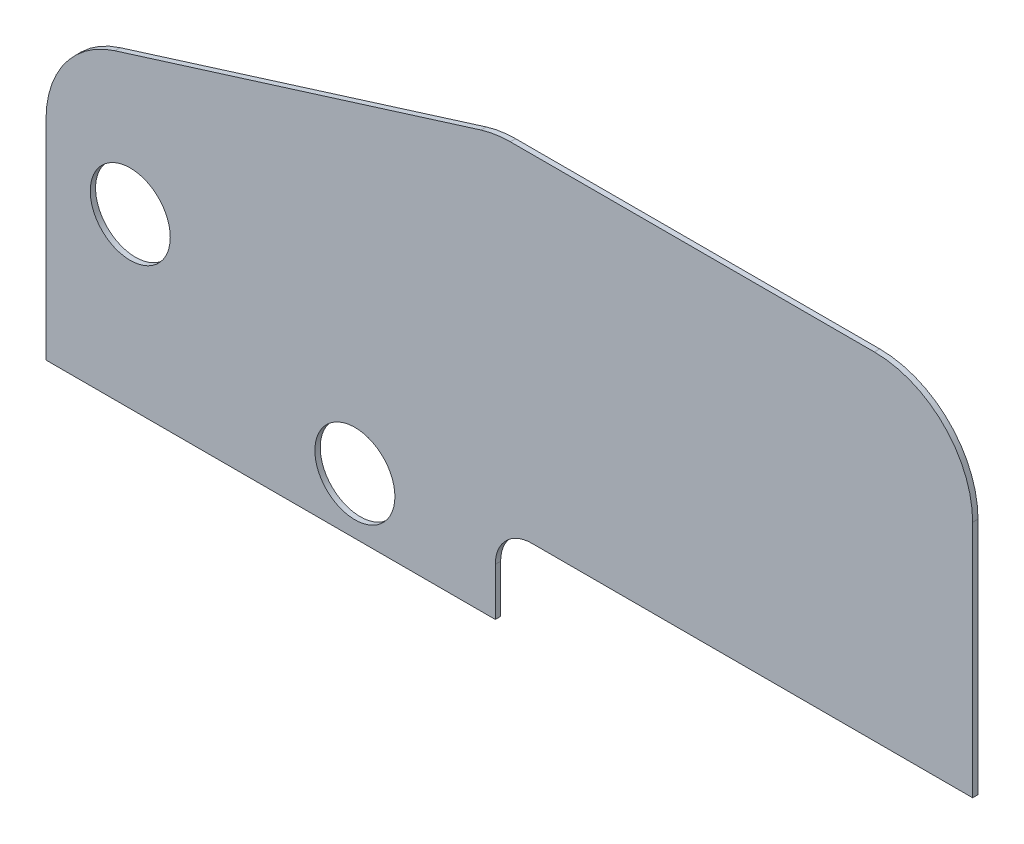
ISO-10303-21;
HEADER;
FILE_DESCRIPTION(('STEP AP214'),'2;1');
FILE_NAME('part.step','',(''),(''),'','','');
FILE_SCHEMA(('AUTOMOTIVE_DESIGN { 1 0 10303 214 1 1 1 1 }'));
ENDSEC;
DATA;
#1=APPLICATION_CONTEXT('core data for automotive mechanical design processes');
#2=APPLICATION_PROTOCOL_DEFINITION('international standard','automotive_design',2000,#1);
#3=PRODUCT_CONTEXT('',#1,'mechanical');
#4=PRODUCT('Part','Part','',(#3));
#5=PRODUCT_RELATED_PRODUCT_CATEGORY('part','',(#4));
#6=PRODUCT_DEFINITION_FORMATION('','',#4);
#7=PRODUCT_DEFINITION_CONTEXT('part definition',#1,'design');
#8=PRODUCT_DEFINITION('design','',#6,#7);
#9=PRODUCT_DEFINITION_SHAPE('','',#8);
#10=(LENGTH_UNIT() NAMED_UNIT(*) SI_UNIT(.MILLI.,.METRE.));
#11=(NAMED_UNIT(*) PLANE_ANGLE_UNIT() SI_UNIT($,.RADIAN.));
#12=(NAMED_UNIT(*) SI_UNIT($,.STERADIAN.) SOLID_ANGLE_UNIT());
#13=UNCERTAINTY_MEASURE_WITH_UNIT(LENGTH_MEASURE(1.E-05),#10,'distance_accuracy_value','');
#14=(GEOMETRIC_REPRESENTATION_CONTEXT(3) GLOBAL_UNCERTAINTY_ASSIGNED_CONTEXT((#13)) GLOBAL_UNIT_ASSIGNED_CONTEXT((#10,
#11,#12)) REPRESENTATION_CONTEXT('',''));
#15=CARTESIAN_POINT('',(0.,0.,0.));
#16=DIRECTION('',(0.,0.,1.));
#17=DIRECTION('',(1.,0.,0.));
#18=AXIS2_PLACEMENT_3D('',#15,#16,#17);
#19=CARTESIAN_POINT('',(0.,0.,1.9));
#20=DIRECTION('',(-1.,0.,0.));
#21=DIRECTION('',(0.,-1.,0.));
#22=AXIS2_PLACEMENT_3D('',#19,#20,#21);
#23=PLANE('',#22);
#24=DIRECTION('',(0.,1.,0.));
#25=VECTOR('',#24,1.);
#26=CARTESIAN_POINT('',(0.,0.,0.));
#27=LINE('',#26,#25);
#28=CARTESIAN_POINT('',(0.,-30.,0.));
#29=VERTEX_POINT('',#28);
#30=CARTESIAN_POINT('',(0.,-13.,0.));
#31=VERTEX_POINT('',#30);
#32=EDGE_CURVE('E176',#29,#31,#27,.T.);
#33=ORIENTED_EDGE('',*,*,#32,.T.);
#34=DIRECTION('',(0.,0.,-1.));
#35=VECTOR('',#34,1.);
#36=CARTESIAN_POINT('',(0.,-13.,1.9));
#37=LINE('',#36,#35);
#38=CARTESIAN_POINT('',(0.,-13.,1.9));
#39=VERTEX_POINT('',#38);
#40=EDGE_CURVE('E207',#31,#39,#37,.F.);
#41=ORIENTED_EDGE('',*,*,#40,.T.);
#42=DIRECTION('',(0.,1.,0.));
#43=VECTOR('',#42,1.);
#44=CARTESIAN_POINT('',(0.,0.,1.9));
#45=LINE('',#44,#43);
#46=CARTESIAN_POINT('',(0.,-30.,1.9));
#47=VERTEX_POINT('',#46);
#48=EDGE_CURVE('E141',#47,#39,#45,.T.);
#49=ORIENTED_EDGE('',*,*,#48,.F.);
#50=DIRECTION('',(0.,0.,-1.));
#51=VECTOR('',#50,1.);
#52=CARTESIAN_POINT('',(0.,-30.,1.9));
#53=LINE('',#52,#51);
#54=EDGE_CURVE('E175',#47,#29,#53,.T.);
#55=ORIENTED_EDGE('',*,*,#54,.T.);
#56=EDGE_LOOP('',(#33,#41,#49,#55));
#57=FACE_BOUND('',#56,.T.);
#58=ADVANCED_FACE('F43',(#57),#23,.F.);
#59=CARTESIAN_POINT('',(170.,0.,1.9));
#60=DIRECTION('',(0.,1.,0.));
#61=DIRECTION('',(-1.,0.,0.));
#62=AXIS2_PLACEMENT_3D('',#59,#60,#61);
#63=PLANE('',#62);
#64=DIRECTION('',(1.,0.,0.));
#65=VECTOR('',#64,1.);
#66=CARTESIAN_POINT('',(170.,0.,1.9));
#67=LINE('',#66,#65);
#68=CARTESIAN_POINT('',(13.,0.,1.9));
#69=VERTEX_POINT('',#68);
#70=CARTESIAN_POINT('',(170.,0.,1.9));
#71=VERTEX_POINT('',#70);
#72=EDGE_CURVE('E128',#69,#71,#67,.T.);
#73=ORIENTED_EDGE('',*,*,#72,.F.);
#74=DIRECTION('',(0.,0.,-1.));
#75=VECTOR('',#74,1.);
#76=CARTESIAN_POINT('',(13.,0.,0.));
#77=LINE('',#76,#75);
#78=CARTESIAN_POINT('',(13.,0.,0.));
#79=VERTEX_POINT('',#78);
#80=EDGE_CURVE('E152',#69,#79,#77,.T.);
#81=ORIENTED_EDGE('',*,*,#80,.T.);
#82=DIRECTION('',(1.,0.,0.));
#83=VECTOR('',#82,1.);
#84=CARTESIAN_POINT('',(170.,0.,0.));
#85=LINE('',#84,#83);
#86=CARTESIAN_POINT('',(170.,0.,0.));
#87=VERTEX_POINT('',#86);
#88=EDGE_CURVE('E147',#79,#87,#85,.T.);
#89=ORIENTED_EDGE('',*,*,#88,.T.);
#90=DIRECTION('',(0.,0.,-1.));
#91=VECTOR('',#90,1.);
#92=CARTESIAN_POINT('',(170.,0.,1.9));
#93=LINE('',#92,#91);
#94=EDGE_CURVE('E144',#71,#87,#93,.T.);
#95=ORIENTED_EDGE('',*,*,#94,.F.);
#96=EDGE_LOOP('',(#73,#81,#89,#95));
#97=FACE_BOUND('',#96,.T.);
#98=ADVANCED_FACE('F145',(#97),#63,.F.);
#99=CARTESIAN_POINT('',(170.,120.,1.9));
#100=DIRECTION('',(-1.,0.,0.));
#101=DIRECTION('',(0.,-1.,0.));
#102=AXIS2_PLACEMENT_3D('',#99,#100,#101);
#103=PLANE('',#102);
#104=DIRECTION('',(0.,1.,0.));
#105=VECTOR('',#104,1.);
#106=CARTESIAN_POINT('',(170.,120.,0.));
#107=LINE('',#106,#105);
#108=CARTESIAN_POINT('',(170.,85.,0.));
#109=VERTEX_POINT('',#108);
#110=EDGE_CURVE('E183',#87,#109,#107,.T.);
#111=ORIENTED_EDGE('',*,*,#110,.T.);
#112=DIRECTION('',(0.,0.,-1.));
#113=VECTOR('',#112,1.);
#114=CARTESIAN_POINT('',(170.,85.,1.9));
#115=LINE('',#114,#113);
#116=CARTESIAN_POINT('',(170.,85.,1.9));
#117=VERTEX_POINT('',#116);
#118=EDGE_CURVE('E157',#109,#117,#115,.F.);
#119=ORIENTED_EDGE('',*,*,#118,.T.);
#120=DIRECTION('',(0.,1.,0.));
#121=VECTOR('',#120,1.);
#122=CARTESIAN_POINT('',(170.,120.,1.9));
#123=LINE('',#122,#121);
#124=EDGE_CURVE('E132',#71,#117,#123,.T.);
#125=ORIENTED_EDGE('',*,*,#124,.F.);
#126=ORIENTED_EDGE('',*,*,#94,.T.);
#127=EDGE_LOOP('',(#111,#119,#125,#126));
#128=FACE_BOUND('',#127,.T.);
#129=ADVANCED_FACE('F155',(#128),#103,.F.);
#130=CARTESIAN_POINT('',(0.,120.,1.9));
#131=DIRECTION('',(0.,-1.,0.));
#132=DIRECTION('',(0.,0.,-1.));
#133=AXIS2_PLACEMENT_3D('',#130,#131,#132);
#134=PLANE('',#133);
#135=DIRECTION('',(-1.,0.,0.));
#136=VECTOR('',#135,1.);
#137=CARTESIAN_POINT('',(0.,120.,1.9));
#138=LINE('',#137,#136);
#139=CARTESIAN_POINT('',(135.,120.,1.9));
#140=VERTEX_POINT('',#139);
#141=CARTESIAN_POINT('',(5.34138229968142,120.,1.9));
#142=VERTEX_POINT('',#141);
#143=EDGE_CURVE('E159',#140,#142,#138,.T.);
#144=ORIENTED_EDGE('',*,*,#143,.F.);
#145=DIRECTION('',(0.,0.,-1.));
#146=VECTOR('',#145,1.);
#147=CARTESIAN_POINT('',(135.,120.,1.9));
#148=LINE('',#147,#146);
#149=CARTESIAN_POINT('',(135.,120.,0.));
#150=VERTEX_POINT('',#149);
#151=EDGE_CURVE('E218',#140,#150,#148,.T.);
#152=ORIENTED_EDGE('',*,*,#151,.T.);
#153=DIRECTION('',(-1.,0.,0.));
#154=VECTOR('',#153,1.);
#155=CARTESIAN_POINT('',(0.,120.,0.));
#156=LINE('',#155,#154);
#157=CARTESIAN_POINT('',(5.34138229968142,120.,0.));
#158=VERTEX_POINT('',#157);
#159=EDGE_CURVE('E186',#150,#158,#156,.T.);
#160=ORIENTED_EDGE('',*,*,#159,.T.);
#161=DIRECTION('',(0.,0.,-1.));
#162=VECTOR('',#161,1.);
#163=CARTESIAN_POINT('',(5.34138229968142,120.,1.9));
#164=LINE('',#163,#162);
#165=EDGE_CURVE('E215',#158,#142,#164,.F.);
#166=ORIENTED_EDGE('',*,*,#165,.T.);
#167=EDGE_LOOP('',(#144,#152,#160,#166));
#168=FACE_BOUND('',#167,.T.);
#169=ADVANCED_FACE('F331',(#168),#134,.F.);
#170=CARTESIAN_POINT('',(-160.,70.,1.9));
#171=DIRECTION('',(0.298274993135947,-0.95447997803503,0.));
#172=DIRECTION('',(0.95447997803503,0.298274993135947,0.));
#173=AXIS2_PLACEMENT_3D('',#170,#171,#172);
#174=PLANE('',#173);
#175=DIRECTION('',(-0.95447997803503,-0.298274993135947,0.));
#176=VECTOR('',#175,1.);
#177=CARTESIAN_POINT('',(-160.,70.,1.9));
#178=LINE('',#177,#176);
#179=CARTESIAN_POINT('',(-5.09824246007673,118.406799231226,1.9));
#180=VERTEX_POINT('',#179);
#181=CARTESIAN_POINT('',(-135.439624759758,77.6751172625756,1.9));
#182=VERTEX_POINT('',#181);
#183=EDGE_CURVE('E163',#180,#182,#178,.T.);
#184=ORIENTED_EDGE('',*,*,#183,.F.);
#185=DIRECTION('',(0.,0.,-1.));
#186=VECTOR('',#185,1.);
#187=CARTESIAN_POINT('',(-5.0982424600767,118.406799231226,1.9));
#188=LINE('',#187,#186);
#189=CARTESIAN_POINT('',(-5.09824246007673,118.406799231226,0.));
#190=VERTEX_POINT('',#189);
#191=EDGE_CURVE('E52',#180,#190,#188,.T.);
#192=ORIENTED_EDGE('',*,*,#191,.T.);
#193=DIRECTION('',(-0.95447997803503,-0.298274993135947,0.));
#194=VECTOR('',#193,1.);
#195=CARTESIAN_POINT('',(-160.,70.,0.));
#196=LINE('',#195,#194);
#197=CARTESIAN_POINT('',(-135.439624759758,77.6751172625756,0.));
#198=VERTEX_POINT('',#197);
#199=EDGE_CURVE('E190',#190,#198,#196,.T.);
#200=ORIENTED_EDGE('',*,*,#199,.T.);
#201=DIRECTION('',(0.,0.,-1.));
#202=VECTOR('',#201,1.);
#203=CARTESIAN_POINT('',(-135.439624759758,77.6751172625756,1.9));
#204=LINE('',#203,#202);
#205=EDGE_CURVE('E67',#198,#182,#204,.F.);
#206=ORIENTED_EDGE('',*,*,#205,.T.);
#207=EDGE_LOOP('',(#184,#192,#200,#206));
#208=FACE_BOUND('',#207,.T.);
#209=ADVANCED_FACE('F246',(#208),#174,.F.);
#210=CARTESIAN_POINT('',(-160.,-30.,1.9));
#211=DIRECTION('',(1.,0.,0.));
#212=DIRECTION('',(0.,0.,-1.));
#213=AXIS2_PLACEMENT_3D('',#210,#211,#212);
#214=PLANE('',#213);
#215=DIRECTION('',(0.,-1.,0.));
#216=VECTOR('',#215,1.);
#217=CARTESIAN_POINT('',(-160.,-30.,1.9));
#218=LINE('',#217,#216);
#219=CARTESIAN_POINT('',(-160.,44.2683180313495,1.9));
#220=VERTEX_POINT('',#219);
#221=CARTESIAN_POINT('',(-160.,-30.,1.9));
#222=VERTEX_POINT('',#221);
#223=EDGE_CURVE('E169',#220,#222,#218,.T.);
#224=ORIENTED_EDGE('',*,*,#223,.F.);
#225=DIRECTION('',(0.,0.,-1.));
#226=VECTOR('',#225,1.);
#227=CARTESIAN_POINT('',(-160.,44.2683180313495,1.9));
#228=LINE('',#227,#226);
#229=CARTESIAN_POINT('',(-160.,44.2683180313495,0.));
#230=VERTEX_POINT('',#229);
#231=EDGE_CURVE('E11',#220,#230,#228,.T.);
#232=ORIENTED_EDGE('',*,*,#231,.T.);
#233=DIRECTION('',(0.,-1.,0.));
#234=VECTOR('',#233,1.);
#235=CARTESIAN_POINT('',(-160.,-30.,0.));
#236=LINE('',#235,#234);
#237=CARTESIAN_POINT('',(-160.,-30.,0.));
#238=VERTEX_POINT('',#237);
#239=EDGE_CURVE('E193',#230,#238,#236,.T.);
#240=ORIENTED_EDGE('',*,*,#239,.T.);
#241=DIRECTION('',(0.,0.,-1.));
#242=VECTOR('',#241,1.);
#243=CARTESIAN_POINT('',(-160.,-30.,1.9));
#244=LINE('',#243,#242);
#245=EDGE_CURVE('E153',#222,#238,#244,.T.);
#246=ORIENTED_EDGE('',*,*,#245,.F.);
#247=EDGE_LOOP('',(#224,#232,#240,#246));
#248=FACE_BOUND('',#247,.T.);
#249=ADVANCED_FACE('F257',(#248),#214,.F.);
#250=CARTESIAN_POINT('',(0.,-30.,1.9));
#251=DIRECTION('',(0.,1.,0.));
#252=DIRECTION('',(-1.,0.,0.));
#253=AXIS2_PLACEMENT_3D('',#250,#251,#252);
#254=PLANE('',#253);
#255=DIRECTION('',(1.,0.,0.));
#256=VECTOR('',#255,1.);
#257=CARTESIAN_POINT('',(0.,-30.,0.));
#258=LINE('',#257,#256);
#259=EDGE_CURVE('E196',#238,#29,#258,.T.);
#260=ORIENTED_EDGE('',*,*,#259,.T.);
#261=ORIENTED_EDGE('',*,*,#54,.F.);
#262=DIRECTION('',(1.,0.,0.));
#263=VECTOR('',#262,1.);
#264=CARTESIAN_POINT('',(0.,-30.,1.9));
#265=LINE('',#264,#263);
#266=EDGE_CURVE('E172',#222,#47,#265,.T.);
#267=ORIENTED_EDGE('',*,*,#266,.F.);
#268=ORIENTED_EDGE('',*,*,#245,.T.);
#269=EDGE_LOOP('',(#260,#261,#267,#268));
#270=FACE_BOUND('',#269,.T.);
#271=ADVANCED_FACE('F263',(#270),#254,.F.);
#272=CARTESIAN_POINT('',(0.,0.,1.9));
#273=DIRECTION('',(0.,0.,-1.));
#274=DIRECTION('',(-1.,0.,0.));
#275=AXIS2_PLACEMENT_3D('',#272,#273,#274);
#276=PLANE('',#275);
#277=CARTESIAN_POINT('',(-50.,-10.,1.9));
#278=DIRECTION('',(0.,0.,1.));
#279=DIRECTION('',(1.,0.,0.));
#280=AXIS2_PLACEMENT_3D('',#277,#278,#279);
#281=CIRCLE('',#280,14.25);
#282=CARTESIAN_POINT('',(-35.75,-10.,1.9));
#283=VERTEX_POINT('',#282);
#284=EDGE_CURVE('E277',#283,#283,#281,.T.);
#285=ORIENTED_EDGE('',*,*,#284,.F.);
#286=EDGE_LOOP('',(#285));
#287=FACE_BOUND('',#286,.T.);
#288=CARTESIAN_POINT('',(-130.,30.,1.9));
#289=DIRECTION('',(0.,0.,1.));
#290=DIRECTION('',(1.,0.,0.));
#291=AXIS2_PLACEMENT_3D('',#288,#289,#290);
#292=CIRCLE('',#291,14.25);
#293=CARTESIAN_POINT('',(-115.75,30.,1.9));
#294=VERTEX_POINT('',#293);
#295=EDGE_CURVE('E273',#294,#294,#292,.T.);
#296=ORIENTED_EDGE('',*,*,#295,.F.);
#297=EDGE_LOOP('',(#296));
#298=FACE_BOUND('',#297,.T.);
#299=ORIENTED_EDGE('',*,*,#124,.T.);
#300=CARTESIAN_POINT('',(135.,85.,1.9));
#301=DIRECTION('',(0.,0.,-1.));
#302=DIRECTION('',(-1.,0.,0.));
#303=AXIS2_PLACEMENT_3D('',#300,#301,#302);
#304=CIRCLE('',#303,35.);
#305=EDGE_CURVE('E238',#117,#140,#304,.F.);
#306=ORIENTED_EDGE('',*,*,#305,.T.);
#307=ORIENTED_EDGE('',*,*,#143,.T.);
#308=CARTESIAN_POINT('',(5.34138229968142,85.,1.9));
#309=DIRECTION('',(0.,0.,-1.));
#310=DIRECTION('',(-1.,0.,0.));
#311=AXIS2_PLACEMENT_3D('',#308,#309,#310);
#312=CIRCLE('',#311,35.);
#313=EDGE_CURVE('E235',#142,#180,#312,.F.);
#314=ORIENTED_EDGE('',*,*,#313,.T.);
#315=ORIENTED_EDGE('',*,*,#183,.T.);
#316=CARTESIAN_POINT('',(-125.,44.2683180313495,1.9));
#317=DIRECTION('',(0.,0.,-1.));
#318=DIRECTION('',(-1.,0.,0.));
#319=AXIS2_PLACEMENT_3D('',#316,#317,#318);
#320=CIRCLE('',#319,35.);
#321=EDGE_CURVE('E59',#182,#220,#320,.F.);
#322=ORIENTED_EDGE('',*,*,#321,.T.);
#323=ORIENTED_EDGE('',*,*,#223,.T.);
#324=ORIENTED_EDGE('',*,*,#266,.T.);
#325=ORIENTED_EDGE('',*,*,#48,.T.);
#326=CARTESIAN_POINT('',(13.,-13.,1.9));
#327=DIRECTION('',(0.,0.,-1.));
#328=DIRECTION('',(-1.,0.,0.));
#329=AXIS2_PLACEMENT_3D('',#326,#327,#328);
#330=CIRCLE('',#329,13.);
#331=EDGE_CURVE('E136',#39,#69,#330,.T.);
#332=ORIENTED_EDGE('',*,*,#331,.T.);
#333=ORIENTED_EDGE('',*,*,#72,.T.);
#334=EDGE_LOOP('',(#299,#306,#307,#314,#315,#322,#323,#324,#325,#332,#333));
#335=FACE_BOUND('',#334,.T.);
#336=ADVANCED_FACE('F130',(#287,#298,#335),#276,.F.);
#337=CARTESIAN_POINT('',(0.,0.,0.));
#338=DIRECTION('',(0.,0.,-1.));
#339=DIRECTION('',(-1.,0.,0.));
#340=AXIS2_PLACEMENT_3D('',#337,#338,#339);
#341=PLANE('',#340);
#342=CARTESIAN_POINT('',(-50.,-10.,0.));
#343=DIRECTION('',(0.,0.,1.));
#344=DIRECTION('',(1.,0.,0.));
#345=AXIS2_PLACEMENT_3D('',#342,#343,#344);
#346=CIRCLE('',#345,14.25);
#347=CARTESIAN_POINT('',(-35.75,-10.,0.));
#348=VERTEX_POINT('',#347);
#349=EDGE_CURVE('E180',#348,#348,#346,.T.);
#350=ORIENTED_EDGE('',*,*,#349,.T.);
#351=EDGE_LOOP('',(#350));
#352=FACE_BOUND('',#351,.T.);
#353=CARTESIAN_POINT('',(-130.,30.,0.));
#354=DIRECTION('',(0.,0.,1.));
#355=DIRECTION('',(1.,0.,0.));
#356=AXIS2_PLACEMENT_3D('',#353,#354,#355);
#357=CIRCLE('',#356,14.25);
#358=CARTESIAN_POINT('',(-115.75,30.,0.));
#359=VERTEX_POINT('',#358);
#360=EDGE_CURVE('E269',#359,#359,#357,.T.);
#361=ORIENTED_EDGE('',*,*,#360,.T.);
#362=EDGE_LOOP('',(#361));
#363=FACE_BOUND('',#362,.T.);
#364=ORIENTED_EDGE('',*,*,#159,.F.);
#365=CARTESIAN_POINT('',(135.,85.,0.));
#366=DIRECTION('',(0.,0.,-1.));
#367=DIRECTION('',(-1.,0.,0.));
#368=AXIS2_PLACEMENT_3D('',#365,#366,#367);
#369=CIRCLE('',#368,35.);
#370=EDGE_CURVE('E228',#150,#109,#369,.T.);
#371=ORIENTED_EDGE('',*,*,#370,.T.);
#372=ORIENTED_EDGE('',*,*,#110,.F.);
#373=ORIENTED_EDGE('',*,*,#88,.F.);
#374=CARTESIAN_POINT('',(13.,-13.,0.));
#375=DIRECTION('',(0.,0.,-1.));
#376=DIRECTION('',(-1.,0.,0.));
#377=AXIS2_PLACEMENT_3D('',#374,#375,#376);
#378=CIRCLE('',#377,13.);
#379=EDGE_CURVE('E210',#79,#31,#378,.F.);
#380=ORIENTED_EDGE('',*,*,#379,.T.);
#381=ORIENTED_EDGE('',*,*,#32,.F.);
#382=ORIENTED_EDGE('',*,*,#259,.F.);
#383=ORIENTED_EDGE('',*,*,#239,.F.);
#384=CARTESIAN_POINT('',(-125.,44.2683180313495,0.));
#385=DIRECTION('',(0.,0.,-1.));
#386=DIRECTION('',(-1.,0.,0.));
#387=AXIS2_PLACEMENT_3D('',#384,#385,#386);
#388=CIRCLE('',#387,35.);
#389=EDGE_CURVE('E222',#230,#198,#388,.T.);
#390=ORIENTED_EDGE('',*,*,#389,.T.);
#391=ORIENTED_EDGE('',*,*,#199,.F.);
#392=CARTESIAN_POINT('',(5.34138229968142,85.,0.));
#393=DIRECTION('',(0.,0.,-1.));
#394=DIRECTION('',(-1.,0.,0.));
#395=AXIS2_PLACEMENT_3D('',#392,#393,#394);
#396=CIRCLE('',#395,35.);
#397=EDGE_CURVE('E225',#190,#158,#396,.T.);
#398=ORIENTED_EDGE('',*,*,#397,.T.);
#399=EDGE_LOOP('',(#364,#371,#372,#373,#380,#381,#382,#383,#390,#391,#398));
#400=FACE_BOUND('',#399,.T.);
#401=ADVANCED_FACE('F251',(#352,#363,#400),#341,.T.);
#402=CARTESIAN_POINT('',(-130.,30.,0.));
#403=DIRECTION('',(0.,0.,1.));
#404=DIRECTION('',(1.,0.,0.));
#405=AXIS2_PLACEMENT_3D('',#402,#403,#404);
#406=CYLINDRICAL_SURFACE('',#405,14.25);
#407=CARTESIAN_POINT('',(-115.75,30.,0.));
#408=CARTESIAN_POINT('',(-115.75,30.,0.0197916666666666));
#409=CARTESIAN_POINT('',(-115.75,30.,0.0395833333333333));
#410=CARTESIAN_POINT('',(-115.75,30.,0.0791666666666667));
#411=CARTESIAN_POINT('',(-115.75,30.,0.0989583333333333));
#412=CARTESIAN_POINT('',(-115.75,30.,0.138541666666667));
#413=CARTESIAN_POINT('',(-115.75,30.,0.158333333333333));
#414=CARTESIAN_POINT('',(-115.75,30.,0.197916666666667));
#415=CARTESIAN_POINT('',(-115.75,30.,0.217708333333333));
#416=CARTESIAN_POINT('',(-115.75,30.,0.257291666666667));
#417=CARTESIAN_POINT('',(-115.75,30.,0.277083333333333));
#418=CARTESIAN_POINT('',(-115.75,30.,0.316666666666667));
#419=CARTESIAN_POINT('',(-115.75,30.,0.336458333333333));
#420=CARTESIAN_POINT('',(-115.75,30.,0.376041666666667));
#421=CARTESIAN_POINT('',(-115.75,30.,0.395833333333333));
#422=CARTESIAN_POINT('',(-115.75,30.,0.435416666666667));
#423=CARTESIAN_POINT('',(-115.75,30.,0.455208333333333));
#424=CARTESIAN_POINT('',(-115.75,30.,0.494791666666667));
#425=CARTESIAN_POINT('',(-115.75,30.,0.514583333333333));
#426=CARTESIAN_POINT('',(-115.75,30.,0.554166666666667));
#427=CARTESIAN_POINT('',(-115.75,30.,0.573958333333333));
#428=CARTESIAN_POINT('',(-115.75,30.,0.613541666666667));
#429=CARTESIAN_POINT('',(-115.75,30.,0.633333333333333));
#430=CARTESIAN_POINT('',(-115.75,30.,0.672916666666667));
#431=CARTESIAN_POINT('',(-115.75,30.,0.692708333333333));
#432=CARTESIAN_POINT('',(-115.75,30.,0.732291666666667));
#433=CARTESIAN_POINT('',(-115.75,30.,0.752083333333333));
#434=CARTESIAN_POINT('',(-115.75,30.,0.791666666666667));
#435=CARTESIAN_POINT('',(-115.75,30.,0.811458333333333));
#436=CARTESIAN_POINT('',(-115.75,30.,0.851041666666667));
#437=CARTESIAN_POINT('',(-115.75,30.,0.870833333333333));
#438=CARTESIAN_POINT('',(-115.75,30.,0.910416666666667));
#439=CARTESIAN_POINT('',(-115.75,30.,0.930208333333333));
#440=CARTESIAN_POINT('',(-115.75,30.,0.969791666666667));
#441=CARTESIAN_POINT('',(-115.75,30.,0.989583333333333));
#442=CARTESIAN_POINT('',(-115.75,30.,1.02916666666667));
#443=CARTESIAN_POINT('',(-115.75,30.,1.04895833333333));
#444=CARTESIAN_POINT('',(-115.75,30.,1.08854166666667));
#445=CARTESIAN_POINT('',(-115.75,30.,1.10833333333333));
#446=CARTESIAN_POINT('',(-115.75,30.,1.14791666666667));
#447=CARTESIAN_POINT('',(-115.75,30.,1.16770833333333));
#448=CARTESIAN_POINT('',(-115.75,30.,1.20729166666667));
#449=CARTESIAN_POINT('',(-115.75,30.,1.22708333333333));
#450=CARTESIAN_POINT('',(-115.75,30.,1.26666666666667));
#451=CARTESIAN_POINT('',(-115.75,30.,1.28645833333333));
#452=CARTESIAN_POINT('',(-115.75,30.,1.32604166666667));
#453=CARTESIAN_POINT('',(-115.75,30.,1.34583333333333));
#454=CARTESIAN_POINT('',(-115.75,30.,1.38541666666667));
#455=CARTESIAN_POINT('',(-115.75,30.,1.40520833333333));
#456=CARTESIAN_POINT('',(-115.75,30.,1.44479166666667));
#457=CARTESIAN_POINT('',(-115.75,30.,1.46458333333333));
#458=CARTESIAN_POINT('',(-115.75,30.,1.50416666666667));
#459=CARTESIAN_POINT('',(-115.75,30.,1.52395833333333));
#460=CARTESIAN_POINT('',(-115.75,30.,1.56354166666667));
#461=CARTESIAN_POINT('',(-115.75,30.,1.58333333333333));
#462=CARTESIAN_POINT('',(-115.75,30.,1.62291666666667));
#463=CARTESIAN_POINT('',(-115.75,30.,1.64270833333333));
#464=CARTESIAN_POINT('',(-115.75,30.,1.68229166666667));
#465=CARTESIAN_POINT('',(-115.75,30.,1.70208333333333));
#466=CARTESIAN_POINT('',(-115.75,30.,1.74166666666667));
#467=CARTESIAN_POINT('',(-115.75,30.,1.76145833333333));
#468=CARTESIAN_POINT('',(-115.75,30.,1.80104166666667));
#469=CARTESIAN_POINT('',(-115.75,30.,1.82083333333333));
#470=CARTESIAN_POINT('',(-115.75,30.,1.86041666666667));
#471=CARTESIAN_POINT('',(-115.75,30.,1.88020833333333));
#472=CARTESIAN_POINT('',(-115.75,30.,1.9));
#473=B_SPLINE_CURVE_WITH_KNOTS('',3,(#407,#408,#409,#410,#411,#412,#413,#414,#415,#416,#417,
#418,#419,#420,#421,#422,#423,#424,#425,#426,#427,#428,#429,#430,#431,#432,#433,#434,#435,#436,
#437,#438,#439,#440,#441,#442,#443,#444,#445,#446,#447,#448,#449,#450,#451,#452,#453,#454,#455,
#456,#457,#458,#459,#460,#461,#462,#463,#464,#465,#466,#467,#468,#469,#470,#471,#472),
.UNSPECIFIED.,.F.,.F.,(4,2,2,2,2,2,2,2,2,2,2,2,2,2,2,2,2,2,2,2,2,2,2,2,2,2,2,2,2,2,2,2,4),(0.,
0.059375,0.11875,0.178125,0.2375,0.296875,0.35625,0.415625,0.475,0.534375,0.59375,0.653125,
0.7125,0.771875,0.83125,0.890625,0.95,1.009375,1.06875,1.128125,1.1875,1.246875,1.30625,
1.365625,1.425,1.484375,1.54375,1.603125,1.6625,1.721875,1.78125,1.840625,1.9),.UNSPECIFIED.);
#474=EDGE_CURVE('BSEAM291',#359,#294,#473,.T.);
#475=ORIENTED_EDGE('',*,*,#360,.F.);
#476=ORIENTED_EDGE('',*,*,#295,.T.);
#477=ORIENTED_EDGE('',*,*,#474,.T.);
#478=ORIENTED_EDGE('',*,*,#474,.F.);
#479=EDGE_LOOP('',(#475,#477,#476,#478));
#480=FACE_BOUND('',#479,.T.);
#481=ADVANCED_FACE('F291',(#480),#406,.F.);
#482=CARTESIAN_POINT('',(-50.,-10.,0.));
#483=DIRECTION('',(0.,0.,1.));
#484=DIRECTION('',(1.,0.,0.));
#485=AXIS2_PLACEMENT_3D('',#482,#483,#484);
#486=CYLINDRICAL_SURFACE('',#485,14.25);
#487=CARTESIAN_POINT('',(-35.75,-10.,0.));
#488=CARTESIAN_POINT('',(-35.75,-10.,0.0197916666666666));
#489=CARTESIAN_POINT('',(-35.75,-10.,0.0395833333333333));
#490=CARTESIAN_POINT('',(-35.75,-10.,0.0791666666666667));
#491=CARTESIAN_POINT('',(-35.75,-10.,0.0989583333333333));
#492=CARTESIAN_POINT('',(-35.75,-10.,0.138541666666667));
#493=CARTESIAN_POINT('',(-35.75,-10.,0.158333333333333));
#494=CARTESIAN_POINT('',(-35.75,-10.,0.197916666666667));
#495=CARTESIAN_POINT('',(-35.75,-10.,0.217708333333333));
#496=CARTESIAN_POINT('',(-35.75,-10.,0.257291666666667));
#497=CARTESIAN_POINT('',(-35.75,-10.,0.277083333333333));
#498=CARTESIAN_POINT('',(-35.75,-10.,0.316666666666667));
#499=CARTESIAN_POINT('',(-35.75,-10.,0.336458333333333));
#500=CARTESIAN_POINT('',(-35.75,-10.,0.376041666666667));
#501=CARTESIAN_POINT('',(-35.75,-10.,0.395833333333333));
#502=CARTESIAN_POINT('',(-35.75,-10.,0.435416666666667));
#503=CARTESIAN_POINT('',(-35.75,-10.,0.455208333333333));
#504=CARTESIAN_POINT('',(-35.75,-10.,0.494791666666667));
#505=CARTESIAN_POINT('',(-35.75,-10.,0.514583333333333));
#506=CARTESIAN_POINT('',(-35.75,-10.,0.554166666666667));
#507=CARTESIAN_POINT('',(-35.75,-10.,0.573958333333333));
#508=CARTESIAN_POINT('',(-35.75,-10.,0.613541666666667));
#509=CARTESIAN_POINT('',(-35.75,-10.,0.633333333333333));
#510=CARTESIAN_POINT('',(-35.75,-10.,0.672916666666667));
#511=CARTESIAN_POINT('',(-35.75,-10.,0.692708333333333));
#512=CARTESIAN_POINT('',(-35.75,-10.,0.732291666666667));
#513=CARTESIAN_POINT('',(-35.75,-10.,0.752083333333333));
#514=CARTESIAN_POINT('',(-35.75,-10.,0.791666666666667));
#515=CARTESIAN_POINT('',(-35.75,-10.,0.811458333333333));
#516=CARTESIAN_POINT('',(-35.75,-10.,0.851041666666667));
#517=CARTESIAN_POINT('',(-35.75,-10.,0.870833333333333));
#518=CARTESIAN_POINT('',(-35.75,-10.,0.910416666666667));
#519=CARTESIAN_POINT('',(-35.75,-10.,0.930208333333333));
#520=CARTESIAN_POINT('',(-35.75,-10.,0.969791666666667));
#521=CARTESIAN_POINT('',(-35.75,-10.,0.989583333333333));
#522=CARTESIAN_POINT('',(-35.75,-10.,1.02916666666667));
#523=CARTESIAN_POINT('',(-35.75,-10.,1.04895833333333));
#524=CARTESIAN_POINT('',(-35.75,-10.,1.08854166666667));
#525=CARTESIAN_POINT('',(-35.75,-10.,1.10833333333333));
#526=CARTESIAN_POINT('',(-35.75,-10.,1.14791666666667));
#527=CARTESIAN_POINT('',(-35.75,-10.,1.16770833333333));
#528=CARTESIAN_POINT('',(-35.75,-10.,1.20729166666667));
#529=CARTESIAN_POINT('',(-35.75,-10.,1.22708333333333));
#530=CARTESIAN_POINT('',(-35.75,-10.,1.26666666666667));
#531=CARTESIAN_POINT('',(-35.75,-10.,1.28645833333333));
#532=CARTESIAN_POINT('',(-35.75,-10.,1.32604166666667));
#533=CARTESIAN_POINT('',(-35.75,-10.,1.34583333333333));
#534=CARTESIAN_POINT('',(-35.75,-10.,1.38541666666667));
#535=CARTESIAN_POINT('',(-35.75,-10.,1.40520833333333));
#536=CARTESIAN_POINT('',(-35.75,-10.,1.44479166666667));
#537=CARTESIAN_POINT('',(-35.75,-10.,1.46458333333333));
#538=CARTESIAN_POINT('',(-35.75,-10.,1.50416666666667));
#539=CARTESIAN_POINT('',(-35.75,-10.,1.52395833333333));
#540=CARTESIAN_POINT('',(-35.75,-10.,1.56354166666667));
#541=CARTESIAN_POINT('',(-35.75,-10.,1.58333333333333));
#542=CARTESIAN_POINT('',(-35.75,-10.,1.62291666666667));
#543=CARTESIAN_POINT('',(-35.75,-10.,1.64270833333333));
#544=CARTESIAN_POINT('',(-35.75,-10.,1.68229166666667));
#545=CARTESIAN_POINT('',(-35.75,-10.,1.70208333333333));
#546=CARTESIAN_POINT('',(-35.75,-10.,1.74166666666667));
#547=CARTESIAN_POINT('',(-35.75,-10.,1.76145833333333));
#548=CARTESIAN_POINT('',(-35.75,-10.,1.80104166666667));
#549=CARTESIAN_POINT('',(-35.75,-10.,1.82083333333333));
#550=CARTESIAN_POINT('',(-35.75,-10.,1.86041666666667));
#551=CARTESIAN_POINT('',(-35.75,-10.,1.88020833333333));
#552=CARTESIAN_POINT('',(-35.75,-10.,1.9));
#553=B_SPLINE_CURVE_WITH_KNOTS('',3,(#487,#488,#489,#490,#491,#492,#493,#494,#495,#496,#497,
#498,#499,#500,#501,#502,#503,#504,#505,#506,#507,#508,#509,#510,#511,#512,#513,#514,#515,#516,
#517,#518,#519,#520,#521,#522,#523,#524,#525,#526,#527,#528,#529,#530,#531,#532,#533,#534,#535,
#536,#537,#538,#539,#540,#541,#542,#543,#544,#545,#546,#547,#548,#549,#550,#551,#552),
.UNSPECIFIED.,.F.,.F.,(4,2,2,2,2,2,2,2,2,2,2,2,2,2,2,2,2,2,2,2,2,2,2,2,2,2,2,2,2,2,2,2,4),(0.,
0.059375,0.11875,0.178125,0.2375,0.296875,0.35625,0.415625,0.475,0.534375,0.59375,0.653125,
0.7125,0.771875,0.83125,0.890625,0.95,1.009375,1.06875,1.128125,1.1875,1.246875,1.30625,
1.365625,1.425,1.484375,1.54375,1.603125,1.6625,1.721875,1.78125,1.840625,1.9),.UNSPECIFIED.);
#554=EDGE_CURVE('BSEAM287',#348,#283,#553,.T.);
#555=ORIENTED_EDGE('',*,*,#349,.F.);
#556=ORIENTED_EDGE('',*,*,#284,.T.);
#557=ORIENTED_EDGE('',*,*,#554,.T.);
#558=ORIENTED_EDGE('',*,*,#554,.F.);
#559=EDGE_LOOP('',(#555,#557,#556,#558));
#560=FACE_BOUND('',#559,.T.);
#561=ADVANCED_FACE('F287',(#560),#486,.F.);
#562=CARTESIAN_POINT('',(13.,-13.,1.9));
#563=DIRECTION('',(0.,0.,1.));
#564=DIRECTION('',(1.,0.,0.));
#565=AXIS2_PLACEMENT_3D('',#562,#563,#564);
#566=CYLINDRICAL_SURFACE('',#565,13.);
#567=ORIENTED_EDGE('',*,*,#331,.F.);
#568=ORIENTED_EDGE('',*,*,#40,.F.);
#569=ORIENTED_EDGE('',*,*,#379,.F.);
#570=ORIENTED_EDGE('',*,*,#80,.F.);
#571=EDGE_LOOP('',(#567,#568,#569,#570));
#572=FACE_BOUND('',#571,.T.);
#573=ADVANCED_FACE('F290',(#572),#566,.F.);
#574=CARTESIAN_POINT('',(135.,85.,1.9));
#575=DIRECTION('',(0.,0.,-1.));
#576=DIRECTION('',(-1.,0.,0.));
#577=AXIS2_PLACEMENT_3D('',#574,#575,#576);
#578=CYLINDRICAL_SURFACE('',#577,35.);
#579=ORIENTED_EDGE('',*,*,#305,.F.);
#580=ORIENTED_EDGE('',*,*,#118,.F.);
#581=ORIENTED_EDGE('',*,*,#370,.F.);
#582=ORIENTED_EDGE('',*,*,#151,.F.);
#583=EDGE_LOOP('',(#579,#580,#581,#582));
#584=FACE_BOUND('',#583,.T.);
#585=ADVANCED_FACE('F318',(#584),#578,.T.);
#586=CARTESIAN_POINT('',(5.34138229968142,85.,1.9));
#587=DIRECTION('',(0.,0.,-1.));
#588=DIRECTION('',(-1.,0.,0.));
#589=AXIS2_PLACEMENT_3D('',#586,#587,#588);
#590=CYLINDRICAL_SURFACE('',#589,35.);
#591=ORIENTED_EDGE('',*,*,#313,.F.);
#592=ORIENTED_EDGE('',*,*,#165,.F.);
#593=ORIENTED_EDGE('',*,*,#397,.F.);
#594=ORIENTED_EDGE('',*,*,#191,.F.);
#595=EDGE_LOOP('',(#591,#592,#593,#594));
#596=FACE_BOUND('',#595,.T.);
#597=ADVANCED_FACE('F321',(#596),#590,.T.);
#598=CARTESIAN_POINT('',(-125.,44.2683180313495,1.9));
#599=DIRECTION('',(0.,0.,-1.));
#600=DIRECTION('',(-1.,0.,0.));
#601=AXIS2_PLACEMENT_3D('',#598,#599,#600);
#602=CYLINDRICAL_SURFACE('',#601,35.);
#603=ORIENTED_EDGE('',*,*,#321,.F.);
#604=ORIENTED_EDGE('',*,*,#205,.F.);
#605=ORIENTED_EDGE('',*,*,#389,.F.);
#606=ORIENTED_EDGE('',*,*,#231,.F.);
#607=EDGE_LOOP('',(#603,#604,#605,#606));
#608=FACE_BOUND('',#607,.T.);
#609=ADVANCED_FACE('F45',(#608),#602,.T.);
#610=CLOSED_SHELL('',(#58,#98,#129,#169,#209,#249,#271,#336,#401,#481,#561,#573,#585,#597,#609));
#611=MANIFOLD_SOLID_BREP('B2',#610);
#612=ADVANCED_BREP_SHAPE_REPRESENTATION('',(#18,#611),#14);
#613=SHAPE_DEFINITION_REPRESENTATION(#9,#612);
ENDSEC;
END-ISO-10303-21;
